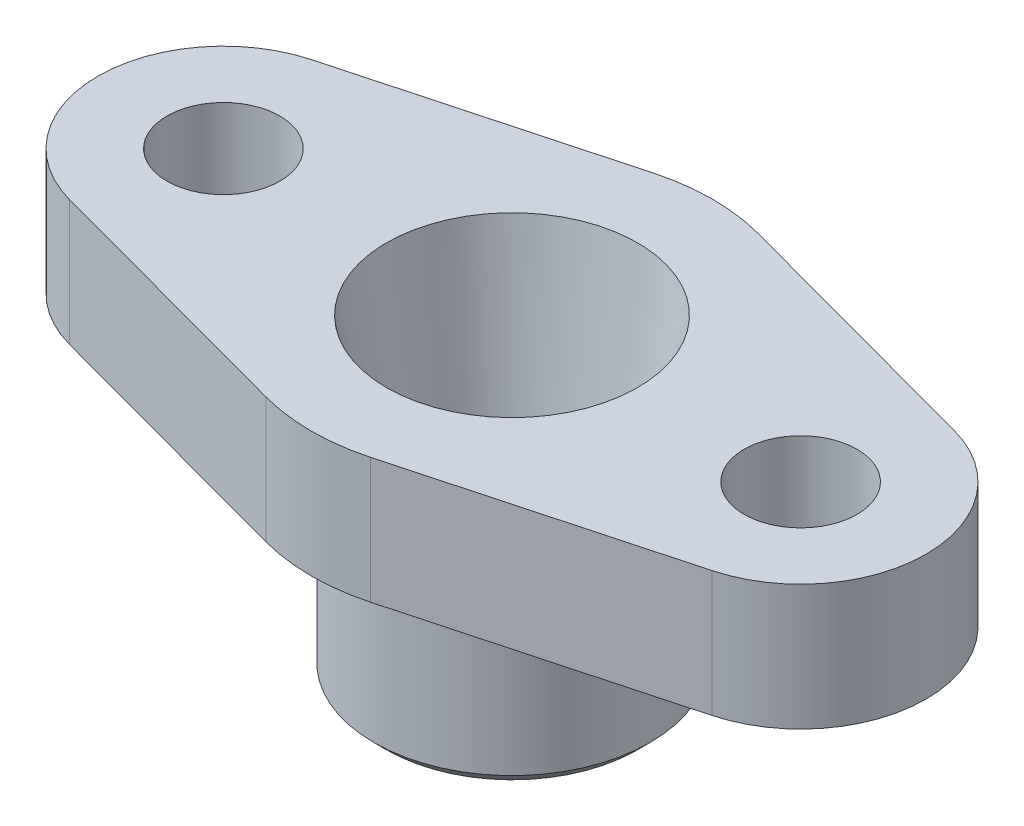
ISO-10303-21;
HEADER;
FILE_DESCRIPTION(('STEP AP214'),'2;1');
FILE_NAME('part.step','',(''),(''),'','','');
FILE_SCHEMA(('AUTOMOTIVE_DESIGN { 1 0 10303 214 1 1 1 1 }'));
ENDSEC;
DATA;
#1=APPLICATION_CONTEXT('core data for automotive mechanical design processes');
#2=APPLICATION_PROTOCOL_DEFINITION('international standard','automotive_design',2000,#1);
#3=PRODUCT_CONTEXT('',#1,'mechanical');
#4=PRODUCT('Part','Part','',(#3));
#5=PRODUCT_RELATED_PRODUCT_CATEGORY('part','',(#4));
#6=PRODUCT_DEFINITION_FORMATION('','',#4);
#7=PRODUCT_DEFINITION_CONTEXT('part definition',#1,'design');
#8=PRODUCT_DEFINITION('design','',#6,#7);
#9=PRODUCT_DEFINITION_SHAPE('','',#8);
#10=(LENGTH_UNIT() NAMED_UNIT(*) SI_UNIT(.MILLI.,.METRE.));
#11=(NAMED_UNIT(*) PLANE_ANGLE_UNIT() SI_UNIT($,.RADIAN.));
#12=(NAMED_UNIT(*) SI_UNIT($,.STERADIAN.) SOLID_ANGLE_UNIT());
#13=UNCERTAINTY_MEASURE_WITH_UNIT(LENGTH_MEASURE(1.E-05),#10,'distance_accuracy_value','');
#14=(GEOMETRIC_REPRESENTATION_CONTEXT(3) GLOBAL_UNCERTAINTY_ASSIGNED_CONTEXT((#13)) GLOBAL_UNIT_ASSIGNED_CONTEXT((#10,
#11,#12)) REPRESENTATION_CONTEXT('',''));
#15=CARTESIAN_POINT('',(0.,0.,0.));
#16=DIRECTION('',(0.,0.,1.));
#17=DIRECTION('',(1.,0.,0.));
#18=AXIS2_PLACEMENT_3D('',#15,#16,#17);
#19=CARTESIAN_POINT('',(23.,-10.,0.));
#20=DIRECTION('',(0.,1.,0.));
#21=DIRECTION('',(0.,0.,1.));
#22=AXIS2_PLACEMENT_3D('',#19,#20,#21);
#23=CYLINDRICAL_SURFACE('',#22,10.);
#24=CARTESIAN_POINT('',(23.,0.,0.));
#25=DIRECTION('',(0.,1.,0.));
#26=DIRECTION('',(0.,0.,-1.));
#27=AXIS2_PLACEMENT_3D('',#24,#25,#26);
#28=CIRCLE('',#27,10.);
#29=CARTESIAN_POINT('',(25.6086956521739,0.,9.65374057007588));
#30=VERTEX_POINT('',#29);
#31=CARTESIAN_POINT('',(25.6086956521739,0.,-9.65374057007589));
#32=VERTEX_POINT('',#31);
#33=EDGE_CURVE('E133',#30,#32,#28,.T.);
#34=ORIENTED_EDGE('',*,*,#33,.F.);
#35=DIRECTION('',(0.,1.,0.));
#36=VECTOR('',#35,1.);
#37=CARTESIAN_POINT('',(25.6086956521739,-10.,9.65374057007588));
#38=LINE('',#37,#36);
#39=CARTESIAN_POINT('',(25.6086956521739,-10.,9.65374057007588));
#40=VERTEX_POINT('',#39);
#41=EDGE_CURVE('E50',#40,#30,#38,.T.);
#42=ORIENTED_EDGE('',*,*,#41,.F.);
#43=CARTESIAN_POINT('',(23.,-10.,0.));
#44=DIRECTION('',(0.,1.,0.));
#45=DIRECTION('',(0.,0.,-1.));
#46=AXIS2_PLACEMENT_3D('',#43,#44,#45);
#47=CIRCLE('',#46,10.);
#48=CARTESIAN_POINT('',(25.6086956521739,-10.,-9.65374057007589));
#49=VERTEX_POINT('',#48);
#50=EDGE_CURVE('E155',#40,#49,#47,.T.);
#51=ORIENTED_EDGE('',*,*,#50,.T.);
#52=DIRECTION('',(0.,1.,0.));
#53=VECTOR('',#52,1.);
#54=CARTESIAN_POINT('',(25.6086956521739,-10.,-9.65374057007589));
#55=LINE('',#54,#53);
#56=EDGE_CURVE('E91',#49,#32,#55,.T.);
#57=ORIENTED_EDGE('',*,*,#56,.T.);
#58=EDGE_LOOP('',(#34,#42,#51,#57));
#59=FACE_BOUND('',#58,.T.);
#60=ADVANCED_FACE('F33',(#59),#23,.T.);
#61=CARTESIAN_POINT('',(25.6086956521739,-10.,9.65374057007588));
#62=DIRECTION('',(0.260869565217391,0.,0.965374057007588));
#63=DIRECTION('',(0.965374057007588,0.,-0.260869565217391));
#64=AXIS2_PLACEMENT_3D('',#61,#62,#63);
#65=PLANE('',#64);
#66=DIRECTION('',(0.965374057007588,0.,-0.260869565217391));
#67=VECTOR('',#66,1.);
#68=CARTESIAN_POINT('',(25.6086956521739,0.,9.65374057007588));
#69=LINE('',#68,#67);
#70=CARTESIAN_POINT('',(4.17391304347826,0.,15.4459849121214));
#71=VERTEX_POINT('',#70);
#72=EDGE_CURVE('E152',#71,#30,#69,.T.);
#73=ORIENTED_EDGE('',*,*,#72,.F.);
#74=DIRECTION('',(0.,1.,0.));
#75=VECTOR('',#74,1.);
#76=CARTESIAN_POINT('',(4.17391304347826,-10.,15.4459849121214));
#77=LINE('',#76,#75);
#78=CARTESIAN_POINT('',(4.17391304347826,-10.,15.4459849121214));
#79=VERTEX_POINT('',#78);
#80=EDGE_CURVE('E79',#79,#71,#77,.T.);
#81=ORIENTED_EDGE('',*,*,#80,.F.);
#82=DIRECTION('',(0.965374057007588,0.,-0.260869565217391));
#83=VECTOR('',#82,1.);
#84=CARTESIAN_POINT('',(25.6086956521739,-10.,9.65374057007588));
#85=LINE('',#84,#83);
#86=EDGE_CURVE('E123',#79,#40,#85,.T.);
#87=ORIENTED_EDGE('',*,*,#86,.T.);
#88=ORIENTED_EDGE('',*,*,#41,.T.);
#89=EDGE_LOOP('',(#73,#81,#87,#88));
#90=FACE_BOUND('',#89,.T.);
#91=ADVANCED_FACE('F187',(#90),#65,.T.);
#92=CARTESIAN_POINT('',(0.,-10.,0.));
#93=DIRECTION('',(0.,1.,0.));
#94=DIRECTION('',(0.,0.,1.));
#95=AXIS2_PLACEMENT_3D('',#92,#93,#94);
#96=CYLINDRICAL_SURFACE('',#95,16.);
#97=CARTESIAN_POINT('',(0.,0.,0.));
#98=DIRECTION('',(0.,1.,0.));
#99=DIRECTION('',(0.,0.,1.));
#100=AXIS2_PLACEMENT_3D('',#97,#98,#99);
#101=CIRCLE('',#100,16.);
#102=CARTESIAN_POINT('',(-4.17391304347826,0.,15.4459849121214));
#103=VERTEX_POINT('',#102);
#104=EDGE_CURVE('E110',#103,#71,#101,.T.);
#105=ORIENTED_EDGE('',*,*,#104,.F.);
#106=DIRECTION('',(0.,1.,0.));
#107=VECTOR('',#106,1.);
#108=CARTESIAN_POINT('',(-4.17391304347826,-10.,15.4459849121214));
#109=LINE('',#108,#107);
#110=CARTESIAN_POINT('',(-4.17391304347826,-10.,15.4459849121214));
#111=VERTEX_POINT('',#110);
#112=EDGE_CURVE('E105',#111,#103,#109,.T.);
#113=ORIENTED_EDGE('',*,*,#112,.F.);
#114=CARTESIAN_POINT('',(0.,-10.,0.));
#115=DIRECTION('',(0.,1.,0.));
#116=DIRECTION('',(0.,0.,1.));
#117=AXIS2_PLACEMENT_3D('',#114,#115,#116);
#118=CIRCLE('',#117,16.);
#119=EDGE_CURVE('E108',#111,#79,#118,.T.);
#120=ORIENTED_EDGE('',*,*,#119,.T.);
#121=ORIENTED_EDGE('',*,*,#80,.T.);
#122=EDGE_LOOP('',(#105,#113,#120,#121));
#123=FACE_BOUND('',#122,.T.);
#124=ADVANCED_FACE('F107',(#123),#96,.T.);
#125=CARTESIAN_POINT('',(-25.6086956521739,-10.,9.65374057007588));
#126=DIRECTION('',(-0.260869565217391,0.,0.965374057007588));
#127=DIRECTION('',(0.965374057007588,0.,0.260869565217391));
#128=AXIS2_PLACEMENT_3D('',#125,#126,#127);
#129=PLANE('',#128);
#130=DIRECTION('',(0.965374057007588,0.,0.260869565217391));
#131=VECTOR('',#130,1.);
#132=CARTESIAN_POINT('',(-25.6086956521739,0.,9.65374057007588));
#133=LINE('',#132,#131);
#134=CARTESIAN_POINT('',(-25.6086956521739,0.,9.65374057007588));
#135=VERTEX_POINT('',#134);
#136=EDGE_CURVE('E149',#135,#103,#133,.T.);
#137=ORIENTED_EDGE('',*,*,#136,.F.);
#138=DIRECTION('',(0.,1.,0.));
#139=VECTOR('',#138,1.);
#140=CARTESIAN_POINT('',(-25.6086956521739,-10.,9.65374057007588));
#141=LINE('',#140,#139);
#142=CARTESIAN_POINT('',(-25.6086956521739,-10.,9.65374057007588));
#143=VERTEX_POINT('',#142);
#144=EDGE_CURVE('E115',#143,#135,#141,.T.);
#145=ORIENTED_EDGE('',*,*,#144,.F.);
#146=DIRECTION('',(0.965374057007588,0.,0.260869565217391));
#147=VECTOR('',#146,1.);
#148=CARTESIAN_POINT('',(-25.6086956521739,-10.,9.65374057007588));
#149=LINE('',#148,#147);
#150=EDGE_CURVE('E121',#143,#111,#149,.T.);
#151=ORIENTED_EDGE('',*,*,#150,.T.);
#152=ORIENTED_EDGE('',*,*,#112,.T.);
#153=EDGE_LOOP('',(#137,#145,#151,#152));
#154=FACE_BOUND('',#153,.T.);
#155=ADVANCED_FACE('F125',(#154),#129,.T.);
#156=CARTESIAN_POINT('',(-23.,-10.,0.));
#157=DIRECTION('',(0.,1.,0.));
#158=DIRECTION('',(0.,0.,1.));
#159=AXIS2_PLACEMENT_3D('',#156,#157,#158);
#160=CYLINDRICAL_SURFACE('',#159,10.);
#161=CARTESIAN_POINT('',(-23.,0.,0.));
#162=DIRECTION('',(0.,1.,0.));
#163=DIRECTION('',(0.,0.,1.));
#164=AXIS2_PLACEMENT_3D('',#161,#162,#163);
#165=CIRCLE('',#164,10.);
#166=CARTESIAN_POINT('',(-25.6086956521739,0.,-9.65374057007588));
#167=VERTEX_POINT('',#166);
#168=EDGE_CURVE('E146',#167,#135,#165,.T.);
#169=ORIENTED_EDGE('',*,*,#168,.F.);
#170=DIRECTION('',(0.,1.,0.));
#171=VECTOR('',#170,1.);
#172=CARTESIAN_POINT('',(-25.6086956521739,-10.,-9.65374057007588));
#173=LINE('',#172,#171);
#174=CARTESIAN_POINT('',(-25.6086956521739,-10.,-9.65374057007588));
#175=VERTEX_POINT('',#174);
#176=EDGE_CURVE('E160',#175,#167,#173,.T.);
#177=ORIENTED_EDGE('',*,*,#176,.F.);
#178=CARTESIAN_POINT('',(-23.,-10.,0.));
#179=DIRECTION('',(0.,1.,0.));
#180=DIRECTION('',(0.,0.,1.));
#181=AXIS2_PLACEMENT_3D('',#178,#179,#180);
#182=CIRCLE('',#181,10.);
#183=EDGE_CURVE('E126',#175,#143,#182,.T.);
#184=ORIENTED_EDGE('',*,*,#183,.T.);
#185=ORIENTED_EDGE('',*,*,#144,.T.);
#186=EDGE_LOOP('',(#169,#177,#184,#185));
#187=FACE_BOUND('',#186,.T.);
#188=ADVANCED_FACE('F204',(#187),#160,.T.);
#189=CARTESIAN_POINT('',(-25.6086956521739,-10.,-9.65374057007588));
#190=DIRECTION('',(-0.260869565217391,0.,-0.965374057007588));
#191=DIRECTION('',(-0.965374057007588,0.,0.260869565217391));
#192=AXIS2_PLACEMENT_3D('',#189,#190,#191);
#193=PLANE('',#192);
#194=DIRECTION('',(-0.965374057007588,0.,0.260869565217391));
#195=VECTOR('',#194,1.);
#196=CARTESIAN_POINT('',(-25.6086956521739,0.,-9.65374057007588));
#197=LINE('',#196,#195);
#198=CARTESIAN_POINT('',(-4.17391304347825,0.,-15.4459849121214));
#199=VERTEX_POINT('',#198);
#200=EDGE_CURVE('E143',#199,#167,#197,.T.);
#201=ORIENTED_EDGE('',*,*,#200,.F.);
#202=DIRECTION('',(0.,1.,0.));
#203=VECTOR('',#202,1.);
#204=CARTESIAN_POINT('',(-4.17391304347825,-10.,-15.4459849121214));
#205=LINE('',#204,#203);
#206=CARTESIAN_POINT('',(-4.17391304347825,-10.,-15.4459849121214));
#207=VERTEX_POINT('',#206);
#208=EDGE_CURVE('E162',#207,#199,#205,.T.);
#209=ORIENTED_EDGE('',*,*,#208,.F.);
#210=DIRECTION('',(-0.965374057007588,0.,0.260869565217391));
#211=VECTOR('',#210,1.);
#212=CARTESIAN_POINT('',(-25.6086956521739,-10.,-9.65374057007588));
#213=LINE('',#212,#211);
#214=EDGE_CURVE('E128',#207,#175,#213,.T.);
#215=ORIENTED_EDGE('',*,*,#214,.T.);
#216=ORIENTED_EDGE('',*,*,#176,.T.);
#217=EDGE_LOOP('',(#201,#209,#215,#216));
#218=FACE_BOUND('',#217,.T.);
#219=ADVANCED_FACE('F200',(#218),#193,.T.);
#220=CARTESIAN_POINT('',(0.,-10.,0.));
#221=DIRECTION('',(0.,1.,0.));
#222=DIRECTION('',(0.,0.,1.));
#223=AXIS2_PLACEMENT_3D('',#220,#221,#222);
#224=CYLINDRICAL_SURFACE('',#223,16.);
#225=CARTESIAN_POINT('',(0.,0.,0.));
#226=DIRECTION('',(0.,1.,0.));
#227=DIRECTION('',(0.,0.,1.));
#228=AXIS2_PLACEMENT_3D('',#225,#226,#227);
#229=CIRCLE('',#228,16.);
#230=CARTESIAN_POINT('',(4.17391304347826,0.,-15.4459849121214));
#231=VERTEX_POINT('',#230);
#232=EDGE_CURVE('E140',#231,#199,#229,.T.);
#233=ORIENTED_EDGE('',*,*,#232,.F.);
#234=DIRECTION('',(0.,1.,0.));
#235=VECTOR('',#234,1.);
#236=CARTESIAN_POINT('',(4.17391304347826,-10.,-15.4459849121214));
#237=LINE('',#236,#235);
#238=CARTESIAN_POINT('',(4.17391304347826,-10.,-15.4459849121214));
#239=VERTEX_POINT('',#238);
#240=EDGE_CURVE('E164',#239,#231,#237,.T.);
#241=ORIENTED_EDGE('',*,*,#240,.F.);
#242=CARTESIAN_POINT('',(0.,-10.,0.));
#243=DIRECTION('',(0.,1.,0.));
#244=DIRECTION('',(0.,0.,1.));
#245=AXIS2_PLACEMENT_3D('',#242,#243,#244);
#246=CIRCLE('',#245,16.);
#247=EDGE_CURVE('E283',#239,#207,#246,.T.);
#248=ORIENTED_EDGE('',*,*,#247,.T.);
#249=ORIENTED_EDGE('',*,*,#208,.T.);
#250=EDGE_LOOP('',(#233,#241,#248,#249));
#251=FACE_BOUND('',#250,.T.);
#252=ADVANCED_FACE('F197',(#251),#224,.T.);
#253=CARTESIAN_POINT('',(25.6086956521739,-10.,-9.65374057007589));
#254=DIRECTION('',(0.260869565217391,0.,-0.965374057007588));
#255=DIRECTION('',(-0.965374057007588,0.,-0.260869565217391));
#256=AXIS2_PLACEMENT_3D('',#253,#254,#255);
#257=PLANE('',#256);
#258=DIRECTION('',(-0.965374057007588,0.,-0.260869565217391));
#259=VECTOR('',#258,1.);
#260=CARTESIAN_POINT('',(25.6086956521739,0.,-9.65374057007589));
#261=LINE('',#260,#259);
#262=EDGE_CURVE('E136',#32,#231,#261,.T.);
#263=ORIENTED_EDGE('',*,*,#262,.F.);
#264=ORIENTED_EDGE('',*,*,#56,.F.);
#265=DIRECTION('',(-0.965374057007588,0.,-0.260869565217391));
#266=VECTOR('',#265,1.);
#267=CARTESIAN_POINT('',(25.6086956521739,-10.,-9.65374057007589));
#268=LINE('',#267,#266);
#269=EDGE_CURVE('E281',#49,#239,#268,.T.);
#270=ORIENTED_EDGE('',*,*,#269,.T.);
#271=ORIENTED_EDGE('',*,*,#240,.T.);
#272=EDGE_LOOP('',(#263,#264,#270,#271));
#273=FACE_BOUND('',#272,.T.);
#274=ADVANCED_FACE('F194',(#273),#257,.T.);
#275=CARTESIAN_POINT('',(23.,-10.,0.));
#276=DIRECTION('',(0.,-1.,0.));
#277=DIRECTION('',(0.,0.,-1.));
#278=AXIS2_PLACEMENT_3D('',#275,#276,#277);
#279=PLANE('',#278);
#280=CARTESIAN_POINT('',(0.,-10.,0.));
#281=DIRECTION('',(0.,-1.,0.));
#282=DIRECTION('',(0.,0.,-1.));
#283=AXIS2_PLACEMENT_3D('',#280,#281,#282);
#284=CIRCLE('',#283,13.);
#285=CARTESIAN_POINT('',(0.,-10.,-13.));
#286=VERTEX_POINT('',#285);
#287=EDGE_CURVE('E169',#286,#286,#284,.F.);
#288=ORIENTED_EDGE('',*,*,#287,.T.);
#289=EDGE_LOOP('',(#288));
#290=FACE_BOUND('',#289,.T.);
#291=CARTESIAN_POINT('',(23.,-10.,0.));
#292=DIRECTION('',(0.,1.,0.));
#293=DIRECTION('',(0.,0.,-1.));
#294=AXIS2_PLACEMENT_3D('',#291,#292,#293);
#295=CIRCLE('',#294,4.5);
#296=CARTESIAN_POINT('',(23.,-10.,-4.50000000000001));
#297=VERTEX_POINT('',#296);
#298=EDGE_CURVE('E270',#297,#297,#295,.T.);
#299=ORIENTED_EDGE('',*,*,#298,.T.);
#300=EDGE_LOOP('',(#299));
#301=FACE_BOUND('',#300,.T.);
#302=CARTESIAN_POINT('',(-23.,-10.,0.));
#303=DIRECTION('',(0.,1.,0.));
#304=DIRECTION('',(0.,0.,1.));
#305=AXIS2_PLACEMENT_3D('',#302,#303,#304);
#306=CIRCLE('',#305,4.5);
#307=CARTESIAN_POINT('',(-23.,-10.,4.5));
#308=VERTEX_POINT('',#307);
#309=EDGE_CURVE('E137',#308,#308,#306,.T.);
#310=ORIENTED_EDGE('',*,*,#309,.T.);
#311=EDGE_LOOP('',(#310));
#312=FACE_BOUND('',#311,.T.);
#313=ORIENTED_EDGE('',*,*,#50,.F.);
#314=ORIENTED_EDGE('',*,*,#86,.F.);
#315=ORIENTED_EDGE('',*,*,#119,.F.);
#316=ORIENTED_EDGE('',*,*,#150,.F.);
#317=ORIENTED_EDGE('',*,*,#183,.F.);
#318=ORIENTED_EDGE('',*,*,#214,.F.);
#319=ORIENTED_EDGE('',*,*,#247,.F.);
#320=ORIENTED_EDGE('',*,*,#269,.F.);
#321=EDGE_LOOP('',(#313,#314,#315,#316,#317,#318,#319,#320));
#322=FACE_BOUND('',#321,.T.);
#323=ADVANCED_FACE('F119',(#290,#301,#312,#322),#279,.T.);
#324=CARTESIAN_POINT('',(23.,0.,0.));
#325=DIRECTION('',(0.,-1.,0.));
#326=DIRECTION('',(0.,0.,-1.));
#327=AXIS2_PLACEMENT_3D('',#324,#325,#326);
#328=PLANE('',#327);
#329=CARTESIAN_POINT('',(0.,0.,0.));
#330=DIRECTION('',(0.,1.,0.));
#331=DIRECTION('',(0.,0.,1.));
#332=AXIS2_PLACEMENT_3D('',#329,#330,#331);
#333=CIRCLE('',#332,10.);
#334=CARTESIAN_POINT('',(0.,0.,10.));
#335=VERTEX_POINT('',#334);
#336=EDGE_CURVE('E266',#335,#335,#333,.T.);
#337=ORIENTED_EDGE('',*,*,#336,.F.);
#338=EDGE_LOOP('',(#337));
#339=FACE_BOUND('',#338,.T.);
#340=CARTESIAN_POINT('',(23.,0.,0.));
#341=DIRECTION('',(0.,1.,0.));
#342=DIRECTION('',(0.,0.,-1.));
#343=AXIS2_PLACEMENT_3D('',#340,#341,#342);
#344=CIRCLE('',#343,4.5);
#345=CARTESIAN_POINT('',(23.,0.,-4.50000000000001));
#346=VERTEX_POINT('',#345);
#347=EDGE_CURVE('E269',#346,#346,#344,.T.);
#348=ORIENTED_EDGE('',*,*,#347,.F.);
#349=EDGE_LOOP('',(#348));
#350=FACE_BOUND('',#349,.T.);
#351=CARTESIAN_POINT('',(-23.,0.,0.));
#352=DIRECTION('',(0.,1.,0.));
#353=DIRECTION('',(0.,0.,1.));
#354=AXIS2_PLACEMENT_3D('',#351,#352,#353);
#355=CIRCLE('',#354,4.5);
#356=CARTESIAN_POINT('',(-23.,0.,4.5));
#357=VERTEX_POINT('',#356);
#358=EDGE_CURVE('E273',#357,#357,#355,.T.);
#359=ORIENTED_EDGE('',*,*,#358,.F.);
#360=EDGE_LOOP('',(#359));
#361=FACE_BOUND('',#360,.T.);
#362=ORIENTED_EDGE('',*,*,#33,.T.);
#363=ORIENTED_EDGE('',*,*,#262,.T.);
#364=ORIENTED_EDGE('',*,*,#232,.T.);
#365=ORIENTED_EDGE('',*,*,#200,.T.);
#366=ORIENTED_EDGE('',*,*,#168,.T.);
#367=ORIENTED_EDGE('',*,*,#136,.T.);
#368=ORIENTED_EDGE('',*,*,#104,.T.);
#369=ORIENTED_EDGE('',*,*,#72,.T.);
#370=EDGE_LOOP('',(#362,#363,#364,#365,#366,#367,#368,#369));
#371=FACE_BOUND('',#370,.T.);
#372=ADVANCED_FACE('F213',(#339,#350,#361,#371),#328,.F.);
#373=CARTESIAN_POINT('',(-23.,-10.,0.));
#374=DIRECTION('',(0.,1.,0.));
#375=DIRECTION('',(0.,0.,1.));
#376=AXIS2_PLACEMENT_3D('',#373,#374,#375);
#377=CYLINDRICAL_SURFACE('',#376,4.5);
#378=ORIENTED_EDGE('',*,*,#309,.F.);
#379=EDGE_LOOP('',(#378));
#380=FACE_BOUND('',#379,.T.);
#381=ORIENTED_EDGE('',*,*,#358,.T.);
#382=EDGE_LOOP('',(#381));
#383=FACE_BOUND('',#382,.T.);
#384=ADVANCED_FACE('F216',(#380,#383),#377,.F.);
#385=CARTESIAN_POINT('',(23.,-10.,0.));
#386=DIRECTION('',(0.,1.,0.));
#387=DIRECTION('',(0.,0.,1.));
#388=AXIS2_PLACEMENT_3D('',#385,#386,#387);
#389=CYLINDRICAL_SURFACE('',#388,4.5);
#390=ORIENTED_EDGE('',*,*,#298,.F.);
#391=EDGE_LOOP('',(#390));
#392=FACE_BOUND('',#391,.T.);
#393=ORIENTED_EDGE('',*,*,#347,.T.);
#394=EDGE_LOOP('',(#393));
#395=FACE_BOUND('',#394,.T.);
#396=ADVANCED_FACE('F223',(#392,#395),#389,.F.);
#397=CARTESIAN_POINT('',(0.,-25.,0.));
#398=DIRECTION('',(0.,1.,0.));
#399=DIRECTION('',(0.,0.,1.));
#400=AXIS2_PLACEMENT_3D('',#397,#398,#399);
#401=CYLINDRICAL_SURFACE('',#400,11.);
#402=CARTESIAN_POINT('',(0.,-24.,0.));
#403=DIRECTION('',(0.,1.,0.));
#404=DIRECTION('',(0.,0.,1.));
#405=AXIS2_PLACEMENT_3D('',#402,#403,#404);
#406=CIRCLE('',#405,11.);
#407=CARTESIAN_POINT('',(0.,-24.,11.));
#408=VERTEX_POINT('',#407);
#409=EDGE_CURVE('E42',#408,#408,#406,.T.);
#410=ORIENTED_EDGE('',*,*,#409,.T.);
#411=EDGE_LOOP('',(#410));
#412=FACE_BOUND('',#411,.T.);
#413=CARTESIAN_POINT('',(0.,-12.,0.));
#414=DIRECTION('',(0.,-1.,0.));
#415=DIRECTION('',(0.,0.,-1.));
#416=AXIS2_PLACEMENT_3D('',#413,#414,#415);
#417=CIRCLE('',#416,11.);
#418=CARTESIAN_POINT('',(0.,-12.,-11.));
#419=VERTEX_POINT('',#418);
#420=EDGE_CURVE('E157',#419,#419,#417,.T.);
#421=ORIENTED_EDGE('',*,*,#420,.T.);
#422=EDGE_LOOP('',(#421));
#423=FACE_BOUND('',#422,.T.);
#424=ADVANCED_FACE('F174',(#412,#423),#401,.T.);
#425=CARTESIAN_POINT('',(0.,-25.,0.));
#426=DIRECTION('',(0.,1.,0.));
#427=DIRECTION('',(0.,0.,1.));
#428=AXIS2_PLACEMENT_3D('',#425,#426,#427);
#429=PLANE('',#428);
#430=CARTESIAN_POINT('',(0.,-25.,0.));
#431=DIRECTION('',(0.,1.,0.));
#432=DIRECTION('',(0.,0.,1.));
#433=AXIS2_PLACEMENT_3D('',#430,#431,#432);
#434=CIRCLE('',#433,10.);
#435=CARTESIAN_POINT('',(0.,-25.,10.));
#436=VERTEX_POINT('',#435);
#437=EDGE_CURVE('E11',#436,#436,#434,.F.);
#438=ORIENTED_EDGE('',*,*,#437,.T.);
#439=EDGE_LOOP('',(#438));
#440=FACE_BOUND('',#439,.T.);
#441=CARTESIAN_POINT('',(0.,-25.,0.));
#442=DIRECTION('',(0.,1.,0.));
#443=DIRECTION('',(0.,0.,1.));
#444=AXIS2_PLACEMENT_3D('',#441,#442,#443);
#445=CIRCLE('',#444,6.);
#446=CARTESIAN_POINT('',(0.,-25.,6.));
#447=VERTEX_POINT('',#446);
#448=EDGE_CURVE('E253',#447,#447,#445,.T.);
#449=ORIENTED_EDGE('',*,*,#448,.T.);
#450=EDGE_LOOP('',(#449));
#451=FACE_BOUND('',#450,.T.);
#452=ADVANCED_FACE('F230',(#440,#451),#429,.F.);
#453=CARTESIAN_POINT('',(0.,0.,0.));
#454=DIRECTION('',(0.,1.,0.));
#455=DIRECTION('',(0.,0.,1.));
#456=AXIS2_PLACEMENT_3D('',#453,#454,#455);
#457=CONICAL_SURFACE('',#456,10.,0.141897054604164);
#458=CARTESIAN_POINT('',(0.,-13.1414213562373,0.));
#459=DIRECTION('',(0.,1.,0.));
#460=DIRECTION('',(0.,0.,1.));
#461=AXIS2_PLACEMENT_3D('',#458,#459,#460);
#462=CIRCLE('',#461,8.1226540919661);
#463=CARTESIAN_POINT('',(0.,-13.1414213562373,8.1226540919661));
#464=VERTEX_POINT('',#463);
#465=EDGE_CURVE('E260',#464,#464,#462,.T.);
#466=ORIENTED_EDGE('',*,*,#465,.F.);
#467=EDGE_LOOP('',(#466));
#468=FACE_BOUND('',#467,.T.);
#469=ORIENTED_EDGE('',*,*,#336,.T.);
#470=EDGE_LOOP('',(#469));
#471=FACE_BOUND('',#470,.T.);
#472=ADVANCED_FACE('F233',(#468,#471),#457,.F.);
#473=CARTESIAN_POINT('',(0.,-13.,0.));
#474=DIRECTION('',(0.,1.,0.));
#475=DIRECTION('',(0.,0.,1.));
#476=AXIS2_PLACEMENT_3D('',#473,#474,#475);
#477=TOROIDAL_SURFACE('',#476,7.13270459830493,1.);
#478=CARTESIAN_POINT('',(0.,-14.,0.));
#479=DIRECTION('',(0.,1.,0.));
#480=DIRECTION('',(0.,0.,1.));
#481=AXIS2_PLACEMENT_3D('',#478,#479,#480);
#482=CIRCLE('',#481,7.13270459830493);
#483=CARTESIAN_POINT('',(0.,-14.,7.13270459830493));
#484=VERTEX_POINT('',#483);
#485=EDGE_CURVE('E257',#484,#484,#482,.T.);
#486=ORIENTED_EDGE('',*,*,#485,.F.);
#487=EDGE_LOOP('',(#486));
#488=FACE_BOUND('',#487,.T.);
#489=ORIENTED_EDGE('',*,*,#465,.T.);
#490=EDGE_LOOP('',(#489));
#491=FACE_BOUND('',#490,.T.);
#492=ADVANCED_FACE('F237',(#488,#491),#477,.F.);
#493=CARTESIAN_POINT('',(-7.13270459830493,-14.,0.));
#494=DIRECTION('',(0.,-1.,0.));
#495=DIRECTION('',(0.,0.,-1.));
#496=AXIS2_PLACEMENT_3D('',#493,#494,#495);
#497=PLANE('',#496);
#498=CARTESIAN_POINT('',(0.,-14.,0.));
#499=DIRECTION('',(0.,1.,0.));
#500=DIRECTION('',(0.,0.,1.));
#501=AXIS2_PLACEMENT_3D('',#498,#499,#500);
#502=CIRCLE('',#501,6.);
#503=CARTESIAN_POINT('',(0.,-14.,6.));
#504=VERTEX_POINT('',#503);
#505=EDGE_CURVE('E256',#504,#504,#502,.T.);
#506=ORIENTED_EDGE('',*,*,#505,.F.);
#507=EDGE_LOOP('',(#506));
#508=FACE_BOUND('',#507,.T.);
#509=ORIENTED_EDGE('',*,*,#485,.T.);
#510=EDGE_LOOP('',(#509));
#511=FACE_BOUND('',#510,.T.);
#512=ADVANCED_FACE('F241',(#508,#511),#497,.F.);
#513=CARTESIAN_POINT('',(0.,4.00627931797736,0.));
#514=DIRECTION('',(0.,1.,0.));
#515=DIRECTION('',(0.,0.,1.));
#516=AXIS2_PLACEMENT_3D('',#513,#514,#515);
#517=CYLINDRICAL_SURFACE('',#516,6.);
#518=ORIENTED_EDGE('',*,*,#448,.F.);
#519=EDGE_LOOP('',(#518));
#520=FACE_BOUND('',#519,.T.);
#521=ORIENTED_EDGE('',*,*,#505,.T.);
#522=EDGE_LOOP('',(#521));
#523=FACE_BOUND('',#522,.T.);
#524=ADVANCED_FACE('F183',(#520,#523),#517,.F.);
#525=CARTESIAN_POINT('',(0.,-12.,0.));
#526=DIRECTION('',(0.,-1.,0.));
#527=DIRECTION('',(0.,0.,-1.));
#528=AXIS2_PLACEMENT_3D('',#525,#526,#527);
#529=TOROIDAL_SURFACE('',#528,13.,2.);
#530=ORIENTED_EDGE('',*,*,#287,.F.);
#531=EDGE_LOOP('',(#530));
#532=FACE_BOUND('',#531,.T.);
#533=ORIENTED_EDGE('',*,*,#420,.F.);
#534=EDGE_LOOP('',(#533));
#535=FACE_BOUND('',#534,.T.);
#536=ADVANCED_FACE('F178',(#532,#535),#529,.F.);
#537=CARTESIAN_POINT('',(0.,-24.,0.));
#538=DIRECTION('',(0.,1.,0.));
#539=DIRECTION('',(0.,0.,1.));
#540=AXIS2_PLACEMENT_3D('',#537,#538,#539);
#541=CONICAL_SURFACE('',#540,11.,0.785398163397454);
#542=ORIENTED_EDGE('',*,*,#437,.F.);
#543=EDGE_LOOP('',(#542));
#544=FACE_BOUND('',#543,.T.);
#545=ORIENTED_EDGE('',*,*,#409,.F.);
#546=EDGE_LOOP('',(#545));
#547=FACE_BOUND('',#546,.T.);
#548=ADVANCED_FACE('F35',(#544,#547),#541,.T.);
#549=CLOSED_SHELL('',(#60,#91,#124,#155,#188,#219,#252,#274,#323,#372,#384,#396,#424,#452,#472,
#492,#512,#524,#536,#548));
#550=MANIFOLD_SOLID_BREP('B2',#549);
#551=ADVANCED_BREP_SHAPE_REPRESENTATION('',(#18,#550),#14);
#552=SHAPE_DEFINITION_REPRESENTATION(#9,#551);
ENDSEC;
END-ISO-10303-21;
